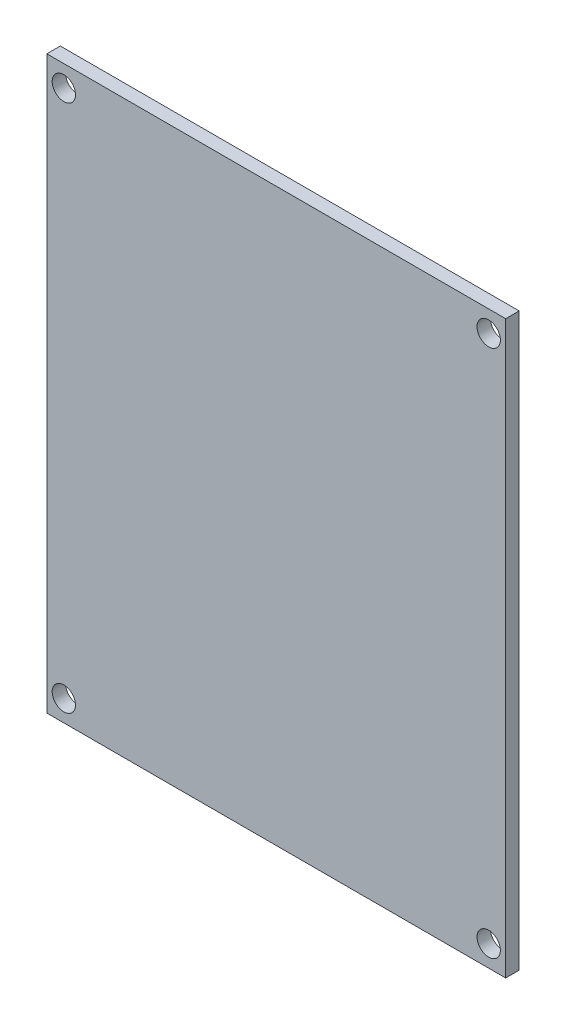
ISO-10303-21;
HEADER;
FILE_DESCRIPTION(('STEP AP214'),'2;1');
FILE_NAME('part.step','',(''),(''),'','','');
FILE_SCHEMA(('AUTOMOTIVE_DESIGN { 1 0 10303 214 1 1 1 1 }'));
ENDSEC;
DATA;
#1=APPLICATION_CONTEXT('core data for automotive mechanical design processes');
#2=APPLICATION_PROTOCOL_DEFINITION('international standard','automotive_design',2000,#1);
#3=PRODUCT_CONTEXT('',#1,'mechanical');
#4=PRODUCT('Part','Part','',(#3));
#5=PRODUCT_RELATED_PRODUCT_CATEGORY('part','',(#4));
#6=PRODUCT_DEFINITION_FORMATION('','',#4);
#7=PRODUCT_DEFINITION_CONTEXT('part definition',#1,'design');
#8=PRODUCT_DEFINITION('design','',#6,#7);
#9=PRODUCT_DEFINITION_SHAPE('','',#8);
#10=(LENGTH_UNIT() NAMED_UNIT(*) SI_UNIT(.MILLI.,.METRE.));
#11=(NAMED_UNIT(*) PLANE_ANGLE_UNIT() SI_UNIT($,.RADIAN.));
#12=(NAMED_UNIT(*) SI_UNIT($,.STERADIAN.) SOLID_ANGLE_UNIT());
#13=UNCERTAINTY_MEASURE_WITH_UNIT(LENGTH_MEASURE(1.E-05),#10,'distance_accuracy_value','');
#14=(GEOMETRIC_REPRESENTATION_CONTEXT(3) GLOBAL_UNCERTAINTY_ASSIGNED_CONTEXT((#13)) GLOBAL_UNIT_ASSIGNED_CONTEXT((#10,
#11,#12)) REPRESENTATION_CONTEXT('',''));
#15=CARTESIAN_POINT('',(0.,0.,0.));
#16=DIRECTION('',(0.,0.,1.));
#17=DIRECTION('',(1.,0.,0.));
#18=AXIS2_PLACEMENT_3D('',#15,#16,#17);
#19=CARTESIAN_POINT('',(60.,-67.25,3.175));
#20=DIRECTION('',(-1.,0.,0.));
#21=DIRECTION('',(0.,0.,1.));
#22=AXIS2_PLACEMENT_3D('',#19,#20,#21);
#23=PLANE('',#22);
#24=DIRECTION('',(0.,1.,0.));
#25=VECTOR('',#24,1.);
#26=CARTESIAN_POINT('',(60.,-67.25,0.));
#27=LINE('',#26,#25);
#28=CARTESIAN_POINT('',(60.,-67.25,0.));
#29=VERTEX_POINT('',#28);
#30=CARTESIAN_POINT('',(60.,67.25,0.));
#31=VERTEX_POINT('',#30);
#32=EDGE_CURVE('E86',#29,#31,#27,.T.);
#33=ORIENTED_EDGE('',*,*,#32,.T.);
#34=DIRECTION('',(0.,0.,-1.));
#35=VECTOR('',#34,1.);
#36=CARTESIAN_POINT('',(60.,67.25,3.175));
#37=LINE('',#36,#35);
#38=CARTESIAN_POINT('',(60.,67.25,3.175));
#39=VERTEX_POINT('',#38);
#40=EDGE_CURVE('E11',#39,#31,#37,.T.);
#41=ORIENTED_EDGE('',*,*,#40,.F.);
#42=DIRECTION('',(0.,1.,0.));
#43=VECTOR('',#42,1.);
#44=CARTESIAN_POINT('',(60.,-67.25,3.175));
#45=LINE('',#44,#43);
#46=CARTESIAN_POINT('',(60.,-67.25,3.175));
#47=VERTEX_POINT('',#46);
#48=EDGE_CURVE('E80',#47,#39,#45,.T.);
#49=ORIENTED_EDGE('',*,*,#48,.F.);
#50=DIRECTION('',(0.,0.,-1.));
#51=VECTOR('',#50,1.);
#52=CARTESIAN_POINT('',(60.,-67.25,3.175));
#53=LINE('',#52,#51);
#54=EDGE_CURVE('E41',#47,#29,#53,.T.);
#55=ORIENTED_EDGE('',*,*,#54,.T.);
#56=EDGE_LOOP('',(#33,#41,#49,#55));
#57=FACE_BOUND('',#56,.T.);
#58=ADVANCED_FACE('F34',(#57),#23,.F.);
#59=CARTESIAN_POINT('',(-60.,67.25,3.175));
#60=DIRECTION('',(0.,-1.,0.));
#61=DIRECTION('',(0.,0.,-1.));
#62=AXIS2_PLACEMENT_3D('',#59,#60,#61);
#63=PLANE('',#62);
#64=DIRECTION('',(-1.,0.,0.));
#65=VECTOR('',#64,1.);
#66=CARTESIAN_POINT('',(-60.,67.25,0.));
#67=LINE('',#66,#65);
#68=CARTESIAN_POINT('',(-48.0802061204508,67.25,0.));
#69=VERTEX_POINT('',#68);
#70=EDGE_CURVE('E81',#31,#69,#67,.T.);
#71=ORIENTED_EDGE('',*,*,#70,.T.);
#72=DIRECTION('',(0.,0.,1.));
#73=VECTOR('',#72,1.);
#74=CARTESIAN_POINT('',(-48.0802061204508,67.25,-0.00100000000000013));
#75=LINE('',#74,#73);
#76=CARTESIAN_POINT('',(-48.0802061204508,67.25,3.175));
#77=VERTEX_POINT('',#76);
#78=EDGE_CURVE('E48',#69,#77,#75,.T.);
#79=ORIENTED_EDGE('',*,*,#78,.T.);
#80=DIRECTION('',(-1.,0.,0.));
#81=VECTOR('',#80,1.);
#82=CARTESIAN_POINT('',(-60.,67.25,3.175));
#83=LINE('',#82,#81);
#84=EDGE_CURVE('E96',#39,#77,#83,.T.);
#85=ORIENTED_EDGE('',*,*,#84,.F.);
#86=ORIENTED_EDGE('',*,*,#40,.T.);
#87=EDGE_LOOP('',(#71,#79,#85,#86));
#88=FACE_BOUND('',#87,.T.);
#89=ADVANCED_FACE('F130',(#88),#63,.F.);
#90=CARTESIAN_POINT('',(-60.,-67.25,3.175));
#91=DIRECTION('',(0.,1.,0.));
#92=DIRECTION('',(0.,0.,1.));
#93=AXIS2_PLACEMENT_3D('',#90,#91,#92);
#94=PLANE('',#93);
#95=DIRECTION('',(1.,0.,0.));
#96=VECTOR('',#95,1.);
#97=CARTESIAN_POINT('',(-60.,-67.25,3.175));
#98=LINE('',#97,#96);
#99=CARTESIAN_POINT('',(-48.0802061204508,-67.25,3.175));
#100=VERTEX_POINT('',#99);
#101=EDGE_CURVE('E57',#100,#47,#98,.T.);
#102=ORIENTED_EDGE('',*,*,#101,.F.);
#103=DIRECTION('',(0.,0.,1.));
#104=VECTOR('',#103,1.);
#105=CARTESIAN_POINT('',(-48.0802061204508,-67.25,-0.00100000000000013));
#106=LINE('',#105,#104);
#107=CARTESIAN_POINT('',(-48.0802061204508,-67.25,0.));
#108=VERTEX_POINT('',#107);
#109=EDGE_CURVE('E77',#108,#100,#106,.T.);
#110=ORIENTED_EDGE('',*,*,#109,.F.);
#111=DIRECTION('',(1.,0.,0.));
#112=VECTOR('',#111,1.);
#113=CARTESIAN_POINT('',(-60.,-67.25,0.));
#114=LINE('',#113,#112);
#115=EDGE_CURVE('E71',#108,#29,#114,.T.);
#116=ORIENTED_EDGE('',*,*,#115,.T.);
#117=ORIENTED_EDGE('',*,*,#54,.F.);
#118=EDGE_LOOP('',(#102,#110,#116,#117));
#119=FACE_BOUND('',#118,.T.);
#120=ADVANCED_FACE('F73',(#119),#94,.F.);
#121=CARTESIAN_POINT('',(0.,0.,3.175));
#122=DIRECTION('',(0.,0.,-1.));
#123=DIRECTION('',(-1.,0.,0.));
#124=AXIS2_PLACEMENT_3D('',#121,#122,#123);
#125=PLANE('',#124);
#126=CARTESIAN_POINT('',(56.0000000000003,62.2499999999979,3.175));
#127=DIRECTION('',(0.,0.,1.));
#128=DIRECTION('',(1.,0.,0.));
#129=AXIS2_PLACEMENT_3D('',#126,#127,#128);
#130=CIRCLE('',#129,2.75);
#131=CARTESIAN_POINT('',(58.7500000000003,62.2499999999979,3.175));
#132=VERTEX_POINT('',#131);
#133=EDGE_CURVE('E114',#132,#132,#130,.T.);
#134=ORIENTED_EDGE('',*,*,#133,.F.);
#135=EDGE_LOOP('',(#134));
#136=FACE_BOUND('',#135,.T.);
#137=CARTESIAN_POINT('',(-44.080206120451,-62.2500000000018,3.175));
#138=DIRECTION('',(0.,0.,1.));
#139=DIRECTION('',(1.,0.,0.));
#140=AXIS2_PLACEMENT_3D('',#137,#138,#139);
#141=CIRCLE('',#140,2.75000000000001);
#142=CARTESIAN_POINT('',(-41.330206120451,-62.2500000000018,3.175));
#143=VERTEX_POINT('',#142);
#144=EDGE_CURVE('E120',#143,#143,#141,.T.);
#145=ORIENTED_EDGE('',*,*,#144,.F.);
#146=EDGE_LOOP('',(#145));
#147=FACE_BOUND('',#146,.T.);
#148=CARTESIAN_POINT('',(55.9999999999999,-62.2500000000021,3.175));
#149=DIRECTION('',(0.,0.,1.));
#150=DIRECTION('',(1.,0.,0.));
#151=AXIS2_PLACEMENT_3D('',#148,#149,#150);
#152=CIRCLE('',#151,2.75000000000001);
#153=CARTESIAN_POINT('',(58.7499999999999,-62.2500000000021,3.175));
#154=VERTEX_POINT('',#153);
#155=EDGE_CURVE('E100',#154,#154,#152,.T.);
#156=ORIENTED_EDGE('',*,*,#155,.F.);
#157=EDGE_LOOP('',(#156));
#158=FACE_BOUND('',#157,.T.);
#159=CARTESIAN_POINT('',(-44.0802061204506,62.2499999999982,3.175));
#160=DIRECTION('',(0.,0.,1.));
#161=DIRECTION('',(1.,0.,0.));
#162=AXIS2_PLACEMENT_3D('',#159,#160,#161);
#163=CIRCLE('',#162,2.75);
#164=CARTESIAN_POINT('',(-41.3302061204506,62.2499999999982,3.175));
#165=VERTEX_POINT('',#164);
#166=EDGE_CURVE('E107',#165,#165,#163,.T.);
#167=ORIENTED_EDGE('',*,*,#166,.F.);
#168=EDGE_LOOP('',(#167));
#169=FACE_BOUND('',#168,.T.);
#170=ORIENTED_EDGE('',*,*,#84,.T.);
#171=DIRECTION('',(0.,1.,0.));
#172=VECTOR('',#171,1.);
#173=CARTESIAN_POINT('',(-48.0802061204508,1.48828304452552E-13,3.175));
#174=LINE('',#173,#172);
#175=EDGE_CURVE('E113',#100,#77,#174,.T.);
#176=ORIENTED_EDGE('',*,*,#175,.F.);
#177=ORIENTED_EDGE('',*,*,#101,.T.);
#178=ORIENTED_EDGE('',*,*,#48,.T.);
#179=EDGE_LOOP('',(#170,#176,#177,#178));
#180=FACE_BOUND('',#179,.T.);
#181=ADVANCED_FACE('F131',(#136,#147,#158,#169,#180),#125,.F.);
#182=CARTESIAN_POINT('',(0.,0.,0.));
#183=DIRECTION('',(0.,0.,-1.));
#184=DIRECTION('',(-1.,0.,0.));
#185=AXIS2_PLACEMENT_3D('',#182,#183,#184);
#186=PLANE('',#185);
#187=DIRECTION('',(0.,1.,0.));
#188=VECTOR('',#187,1.);
#189=CARTESIAN_POINT('',(-48.0802061204508,1.48828304452552E-13,0.));
#190=LINE('',#189,#188);
#191=EDGE_CURVE('E90',#108,#69,#190,.T.);
#192=ORIENTED_EDGE('',*,*,#191,.T.);
#193=ORIENTED_EDGE('',*,*,#70,.F.);
#194=ORIENTED_EDGE('',*,*,#32,.F.);
#195=ORIENTED_EDGE('',*,*,#115,.F.);
#196=EDGE_LOOP('',(#192,#193,#194,#195));
#197=FACE_BOUND('',#196,.T.);
#198=CARTESIAN_POINT('',(56.0000000000003,62.2499999999979,0.));
#199=DIRECTION('',(0.,0.,-1.));
#200=DIRECTION('',(-1.,0.,0.));
#201=AXIS2_PLACEMENT_3D('',#198,#199,#200);
#202=CIRCLE('',#201,2.75);
#203=CARTESIAN_POINT('',(53.2500000000003,62.2499999999979,0.));
#204=VERTEX_POINT('',#203);
#205=EDGE_CURVE('E117',#204,#204,#202,.F.);
#206=ORIENTED_EDGE('',*,*,#205,.T.);
#207=EDGE_LOOP('',(#206));
#208=FACE_BOUND('',#207,.T.);
#209=CARTESIAN_POINT('',(-44.080206120451,-62.2500000000018,0.));
#210=DIRECTION('',(0.,0.,-1.));
#211=DIRECTION('',(-1.,0.,0.));
#212=AXIS2_PLACEMENT_3D('',#209,#210,#211);
#213=CIRCLE('',#212,2.75000000000001);
#214=CARTESIAN_POINT('',(-46.830206120451,-62.2500000000018,0.));
#215=VERTEX_POINT('',#214);
#216=EDGE_CURVE('E104',#215,#215,#213,.F.);
#217=ORIENTED_EDGE('',*,*,#216,.T.);
#218=EDGE_LOOP('',(#217));
#219=FACE_BOUND('',#218,.T.);
#220=CARTESIAN_POINT('',(55.9999999999999,-62.2500000000021,0.));
#221=DIRECTION('',(0.,0.,-1.));
#222=DIRECTION('',(-1.,0.,0.));
#223=AXIS2_PLACEMENT_3D('',#220,#221,#222);
#224=CIRCLE('',#223,2.75000000000001);
#225=CARTESIAN_POINT('',(53.2499999999999,-62.2500000000021,0.));
#226=VERTEX_POINT('',#225);
#227=EDGE_CURVE('E103',#226,#226,#224,.F.);
#228=ORIENTED_EDGE('',*,*,#227,.T.);
#229=EDGE_LOOP('',(#228));
#230=FACE_BOUND('',#229,.T.);
#231=CARTESIAN_POINT('',(-44.0802061204506,62.2499999999982,0.));
#232=DIRECTION('',(0.,0.,-1.));
#233=DIRECTION('',(-1.,0.,0.));
#234=AXIS2_PLACEMENT_3D('',#231,#232,#233);
#235=CIRCLE('',#234,2.75);
#236=CARTESIAN_POINT('',(-46.8302061204506,62.2499999999982,0.));
#237=VERTEX_POINT('',#236);
#238=EDGE_CURVE('E110',#237,#237,#235,.F.);
#239=ORIENTED_EDGE('',*,*,#238,.T.);
#240=EDGE_LOOP('',(#239));
#241=FACE_BOUND('',#240,.T.);
#242=ADVANCED_FACE('F87',(#197,#208,#219,#230,#241),#186,.T.);
#243=CARTESIAN_POINT('',(-44.0802061204506,62.2499999999982,-0.00100000000000013));
#244=DIRECTION('',(0.,0.,1.));
#245=DIRECTION('',(1.,0.,0.));
#246=AXIS2_PLACEMENT_3D('',#243,#244,#245);
#247=CYLINDRICAL_SURFACE('',#246,2.75);
#248=ORIENTED_EDGE('',*,*,#238,.F.);
#249=EDGE_LOOP('',(#248));
#250=FACE_BOUND('',#249,.T.);
#251=ORIENTED_EDGE('',*,*,#166,.T.);
#252=EDGE_LOOP('',(#251));
#253=FACE_BOUND('',#252,.T.);
#254=ADVANCED_FACE('F139',(#250,#253),#247,.F.);
#255=CARTESIAN_POINT('',(55.9999999999999,-62.2500000000021,-0.00100000000000013));
#256=DIRECTION('',(0.,0.,1.));
#257=DIRECTION('',(1.,0.,0.));
#258=AXIS2_PLACEMENT_3D('',#255,#256,#257);
#259=CYLINDRICAL_SURFACE('',#258,2.75000000000001);
#260=ORIENTED_EDGE('',*,*,#227,.F.);
#261=EDGE_LOOP('',(#260));
#262=FACE_BOUND('',#261,.T.);
#263=ORIENTED_EDGE('',*,*,#155,.T.);
#264=EDGE_LOOP('',(#263));
#265=FACE_BOUND('',#264,.T.);
#266=ADVANCED_FACE('F174',(#262,#265),#259,.F.);
#267=CARTESIAN_POINT('',(-44.080206120451,-62.2500000000018,-0.00100000000000013));
#268=DIRECTION('',(0.,0.,1.));
#269=DIRECTION('',(1.,0.,0.));
#270=AXIS2_PLACEMENT_3D('',#267,#268,#269);
#271=CYLINDRICAL_SURFACE('',#270,2.75000000000001);
#272=ORIENTED_EDGE('',*,*,#216,.F.);
#273=EDGE_LOOP('',(#272));
#274=FACE_BOUND('',#273,.T.);
#275=ORIENTED_EDGE('',*,*,#144,.T.);
#276=EDGE_LOOP('',(#275));
#277=FACE_BOUND('',#276,.T.);
#278=ADVANCED_FACE('F184',(#274,#277),#271,.F.);
#279=CARTESIAN_POINT('',(56.0000000000003,62.2499999999979,-0.00100000000000013));
#280=DIRECTION('',(0.,0.,1.));
#281=DIRECTION('',(1.,0.,0.));
#282=AXIS2_PLACEMENT_3D('',#279,#280,#281);
#283=CYLINDRICAL_SURFACE('',#282,2.75);
#284=ORIENTED_EDGE('',*,*,#205,.F.);
#285=EDGE_LOOP('',(#284));
#286=FACE_BOUND('',#285,.T.);
#287=ORIENTED_EDGE('',*,*,#133,.T.);
#288=EDGE_LOOP('',(#287));
#289=FACE_BOUND('',#288,.T.);
#290=ADVANCED_FACE('F193',(#286,#289),#283,.F.);
#291=CARTESIAN_POINT('',(-48.0802061204508,1.48828304452552E-13,-0.00100000000000013));
#292=DIRECTION('',(1.,0.,0.));
#293=DIRECTION('',(0.,1.,0.));
#294=AXIS2_PLACEMENT_3D('',#291,#292,#293);
#295=PLANE('',#294);
#296=ORIENTED_EDGE('',*,*,#109,.T.);
#297=ORIENTED_EDGE('',*,*,#175,.T.);
#298=ORIENTED_EDGE('',*,*,#78,.F.);
#299=ORIENTED_EDGE('',*,*,#191,.F.);
#300=EDGE_LOOP('',(#296,#297,#298,#299));
#301=FACE_BOUND('',#300,.T.);
#302=ADVANCED_FACE('F127',(#301),#295,.F.);
#303=CLOSED_SHELL('',(#58,#89,#120,#181,#242,#254,#266,#278,#290,#302));
#304=MANIFOLD_SOLID_BREP('B2',#303);
#305=ADVANCED_BREP_SHAPE_REPRESENTATION('',(#18,#304),#14);
#306=SHAPE_DEFINITION_REPRESENTATION(#9,#305);
ENDSEC;
END-ISO-10303-21;
